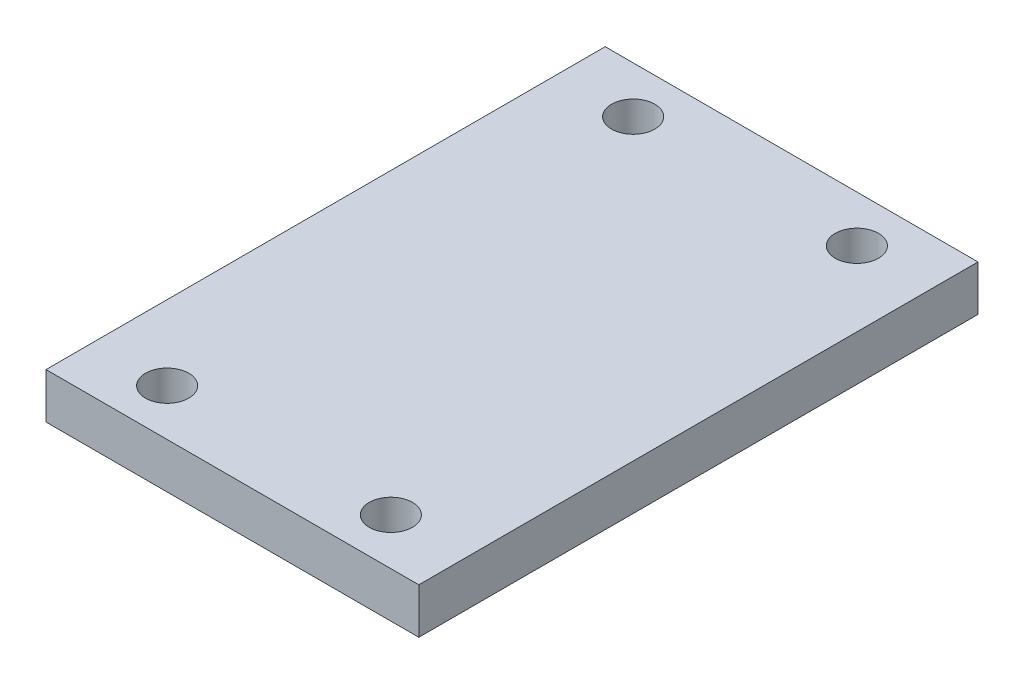
ISO-10303-21;
HEADER;
FILE_DESCRIPTION(('STEP AP214'),'2;1');
FILE_NAME('part.step','',(''),(''),'','','');
FILE_SCHEMA(('AUTOMOTIVE_DESIGN { 1 0 10303 214 1 1 1 1 }'));
ENDSEC;
DATA;
#1=APPLICATION_CONTEXT('core data for automotive mechanical design processes');
#2=APPLICATION_PROTOCOL_DEFINITION('international standard','automotive_design',2000,#1);
#3=PRODUCT_CONTEXT('',#1,'mechanical');
#4=PRODUCT('Part','Part','',(#3));
#5=PRODUCT_RELATED_PRODUCT_CATEGORY('part','',(#4));
#6=PRODUCT_DEFINITION_FORMATION('','',#4);
#7=PRODUCT_DEFINITION_CONTEXT('part definition',#1,'design');
#8=PRODUCT_DEFINITION('design','',#6,#7);
#9=PRODUCT_DEFINITION_SHAPE('','',#8);
#10=(LENGTH_UNIT() NAMED_UNIT(*) SI_UNIT(.MILLI.,.METRE.));
#11=(NAMED_UNIT(*) PLANE_ANGLE_UNIT() SI_UNIT($,.RADIAN.));
#12=(NAMED_UNIT(*) SI_UNIT($,.STERADIAN.) SOLID_ANGLE_UNIT());
#13=UNCERTAINTY_MEASURE_WITH_UNIT(LENGTH_MEASURE(1.E-05),#10,'distance_accuracy_value','');
#14=(GEOMETRIC_REPRESENTATION_CONTEXT(3) GLOBAL_UNCERTAINTY_ASSIGNED_CONTEXT((#13)) GLOBAL_UNIT_ASSIGNED_CONTEXT((#10,
#11,#12)) REPRESENTATION_CONTEXT('',''));
#15=CARTESIAN_POINT('',(0.,0.,0.));
#16=DIRECTION('',(0.,0.,1.));
#17=DIRECTION('',(1.,0.,0.));
#18=AXIS2_PLACEMENT_3D('',#15,#16,#17);
#19=CARTESIAN_POINT('',(-25.4,3.0988,19.05));
#20=DIRECTION('',(0.,1.,0.));
#21=DIRECTION('',(0.,0.,1.));
#22=AXIS2_PLACEMENT_3D('',#19,#20,#21);
#23=PLANE('',#22);
#24=CARTESIAN_POINT('',(-20.32,3.0988,-15.875));
#25=DIRECTION('',(0.,1.,0.));
#26=DIRECTION('',(0.,0.,-1.));
#27=AXIS2_PLACEMENT_3D('',#24,#25,#26);
#28=CIRCLE('',#27,1.4732);
#29=CARTESIAN_POINT('',(-20.32,3.0988,-17.3482));
#30=VERTEX_POINT('',#29);
#31=EDGE_CURVE('E152',#30,#30,#28,.T.);
#32=ORIENTED_EDGE('',*,*,#31,.F.);
#33=EDGE_LOOP('',(#32));
#34=FACE_BOUND('',#33,.T.);
#35=CARTESIAN_POINT('',(-5.08000000000001,3.0988,-15.875));
#36=DIRECTION('',(0.,1.,0.));
#37=DIRECTION('',(0.,0.,1.));
#38=AXIS2_PLACEMENT_3D('',#35,#36,#37);
#39=CIRCLE('',#38,1.4732);
#40=CARTESIAN_POINT('',(-5.08000000000001,3.0988,-14.4018));
#41=VERTEX_POINT('',#40);
#42=EDGE_CURVE('E122',#41,#41,#39,.T.);
#43=ORIENTED_EDGE('',*,*,#42,.F.);
#44=EDGE_LOOP('',(#43));
#45=FACE_BOUND('',#44,.T.);
#46=DIRECTION('',(0.,0.,1.));
#47=VECTOR('',#46,1.);
#48=CARTESIAN_POINT('',(-25.4,3.0988,-19.05));
#49=LINE('',#48,#47);
#50=CARTESIAN_POINT('',(-25.4,3.0988,-19.05));
#51=VERTEX_POINT('',#50);
#52=CARTESIAN_POINT('',(-25.4,3.0988,19.05));
#53=VERTEX_POINT('',#52);
#54=EDGE_CURVE('E100',#51,#53,#49,.T.);
#55=ORIENTED_EDGE('',*,*,#54,.T.);
#56=DIRECTION('',(1.,0.,0.));
#57=VECTOR('',#56,1.);
#58=CARTESIAN_POINT('',(-25.4,3.0988,19.05));
#59=LINE('',#58,#57);
#60=CARTESIAN_POINT('',(0.,3.0988,19.05));
#61=VERTEX_POINT('',#60);
#62=EDGE_CURVE('E94',#53,#61,#59,.T.);
#63=ORIENTED_EDGE('',*,*,#62,.T.);
#64=DIRECTION('',(0.,0.,-1.));
#65=VECTOR('',#64,1.);
#66=CARTESIAN_POINT('',(0.,3.0988,-19.05));
#67=LINE('',#66,#65);
#68=CARTESIAN_POINT('',(0.,3.0988,-19.05));
#69=VERTEX_POINT('',#68);
#70=EDGE_CURVE('E98',#61,#69,#67,.T.);
#71=ORIENTED_EDGE('',*,*,#70,.T.);
#72=DIRECTION('',(-1.,0.,0.));
#73=VECTOR('',#72,1.);
#74=CARTESIAN_POINT('',(-25.4,3.0988,-19.05));
#75=LINE('',#74,#73);
#76=EDGE_CURVE('E60',#69,#51,#75,.T.);
#77=ORIENTED_EDGE('',*,*,#76,.T.);
#78=EDGE_LOOP('',(#55,#63,#71,#77));
#79=FACE_BOUND('',#78,.T.);
#80=CARTESIAN_POINT('',(-20.32,3.0988,15.875));
#81=DIRECTION('',(0.,1.,0.));
#82=DIRECTION('',(0.,0.,1.));
#83=AXIS2_PLACEMENT_3D('',#80,#81,#82);
#84=CIRCLE('',#83,1.4732);
#85=CARTESIAN_POINT('',(-20.32,3.0988,17.3482));
#86=VERTEX_POINT('',#85);
#87=EDGE_CURVE('E144',#86,#86,#84,.T.);
#88=ORIENTED_EDGE('',*,*,#87,.F.);
#89=EDGE_LOOP('',(#88));
#90=FACE_BOUND('',#89,.T.);
#91=CARTESIAN_POINT('',(-5.08000000000001,3.0988,15.875));
#92=DIRECTION('',(0.,1.,0.));
#93=DIRECTION('',(0.,0.,-1.));
#94=AXIS2_PLACEMENT_3D('',#91,#92,#93);
#95=CIRCLE('',#94,1.4732);
#96=CARTESIAN_POINT('',(-5.08000000000001,3.0988,14.4018));
#97=VERTEX_POINT('',#96);
#98=EDGE_CURVE('E159',#97,#97,#95,.T.);
#99=ORIENTED_EDGE('',*,*,#98,.F.);
#100=EDGE_LOOP('',(#99));
#101=FACE_BOUND('',#100,.T.);
#102=ADVANCED_FACE('F39',(#34,#45,#79,#90,#101),#23,.T.);
#103=CARTESIAN_POINT('',(-25.4,0.,19.05));
#104=DIRECTION('',(0.,1.,0.));
#105=DIRECTION('',(0.,0.,1.));
#106=AXIS2_PLACEMENT_3D('',#103,#104,#105);
#107=PLANE('',#106);
#108=CARTESIAN_POINT('',(-20.32,0.,-15.875));
#109=DIRECTION('',(0.,1.,0.));
#110=DIRECTION('',(0.,0.,-1.));
#111=AXIS2_PLACEMENT_3D('',#108,#109,#110);
#112=CIRCLE('',#111,1.4732);
#113=CARTESIAN_POINT('',(-20.32,0.,-17.3482));
#114=VERTEX_POINT('',#113);
#115=EDGE_CURVE('E155',#114,#114,#112,.T.);
#116=ORIENTED_EDGE('',*,*,#115,.T.);
#117=EDGE_LOOP('',(#116));
#118=FACE_BOUND('',#117,.T.);
#119=CARTESIAN_POINT('',(-5.08000000000001,0.,-15.875));
#120=DIRECTION('',(0.,1.,0.));
#121=DIRECTION('',(0.,0.,1.));
#122=AXIS2_PLACEMENT_3D('',#119,#120,#121);
#123=CIRCLE('',#122,1.4732);
#124=CARTESIAN_POINT('',(-5.08000000000001,0.,-14.4018));
#125=VERTEX_POINT('',#124);
#126=EDGE_CURVE('E140',#125,#125,#123,.T.);
#127=ORIENTED_EDGE('',*,*,#126,.T.);
#128=EDGE_LOOP('',(#127));
#129=FACE_BOUND('',#128,.T.);
#130=DIRECTION('',(0.,0.,1.));
#131=VECTOR('',#130,1.);
#132=CARTESIAN_POINT('',(-25.4,0.,-19.05));
#133=LINE('',#132,#131);
#134=CARTESIAN_POINT('',(-25.4,0.,-19.05));
#135=VERTEX_POINT('',#134);
#136=CARTESIAN_POINT('',(-25.4,0.,19.05));
#137=VERTEX_POINT('',#136);
#138=EDGE_CURVE('E118',#135,#137,#133,.T.);
#139=ORIENTED_EDGE('',*,*,#138,.F.);
#140=DIRECTION('',(-1.,0.,0.));
#141=VECTOR('',#140,1.);
#142=CARTESIAN_POINT('',(-25.4,0.,-19.05));
#143=LINE('',#142,#141);
#144=CARTESIAN_POINT('',(0.,0.,-19.05));
#145=VERTEX_POINT('',#144);
#146=EDGE_CURVE('E86',#145,#135,#143,.T.);
#147=ORIENTED_EDGE('',*,*,#146,.F.);
#148=DIRECTION('',(0.,0.,-1.));
#149=VECTOR('',#148,1.);
#150=CARTESIAN_POINT('',(0.,0.,-19.05));
#151=LINE('',#150,#149);
#152=CARTESIAN_POINT('',(0.,0.,19.05));
#153=VERTEX_POINT('',#152);
#154=EDGE_CURVE('E80',#153,#145,#151,.T.);
#155=ORIENTED_EDGE('',*,*,#154,.F.);
#156=DIRECTION('',(1.,0.,0.));
#157=VECTOR('',#156,1.);
#158=CARTESIAN_POINT('',(-25.4,0.,19.05));
#159=LINE('',#158,#157);
#160=EDGE_CURVE('E105',#137,#153,#159,.T.);
#161=ORIENTED_EDGE('',*,*,#160,.F.);
#162=EDGE_LOOP('',(#139,#147,#155,#161));
#163=FACE_BOUND('',#162,.T.);
#164=CARTESIAN_POINT('',(-20.32,0.,15.875));
#165=DIRECTION('',(0.,1.,0.));
#166=DIRECTION('',(0.,0.,1.));
#167=AXIS2_PLACEMENT_3D('',#164,#165,#166);
#168=CIRCLE('',#167,1.4732);
#169=CARTESIAN_POINT('',(-20.32,0.,17.3482));
#170=VERTEX_POINT('',#169);
#171=EDGE_CURVE('E148',#170,#170,#168,.T.);
#172=ORIENTED_EDGE('',*,*,#171,.T.);
#173=EDGE_LOOP('',(#172));
#174=FACE_BOUND('',#173,.T.);
#175=CARTESIAN_POINT('',(-5.08000000000001,0.,15.875));
#176=DIRECTION('',(0.,1.,0.));
#177=DIRECTION('',(0.,0.,-1.));
#178=AXIS2_PLACEMENT_3D('',#175,#176,#177);
#179=CIRCLE('',#178,1.4732);
#180=CARTESIAN_POINT('',(-5.08000000000001,0.,14.4018));
#181=VERTEX_POINT('',#180);
#182=EDGE_CURVE('E163',#181,#181,#179,.T.);
#183=ORIENTED_EDGE('',*,*,#182,.T.);
#184=EDGE_LOOP('',(#183));
#185=FACE_BOUND('',#184,.T.);
#186=ADVANCED_FACE('F134',(#118,#129,#163,#174,#185),#107,.F.);
#187=CARTESIAN_POINT('',(-25.4,3.0988,-19.05));
#188=DIRECTION('',(1.,0.,0.));
#189=DIRECTION('',(0.,0.,-1.));
#190=AXIS2_PLACEMENT_3D('',#187,#188,#189);
#191=PLANE('',#190);
#192=ORIENTED_EDGE('',*,*,#138,.T.);
#193=DIRECTION('',(0.,-1.,0.));
#194=VECTOR('',#193,1.);
#195=CARTESIAN_POINT('',(-25.4,3.0988,19.05));
#196=LINE('',#195,#194);
#197=EDGE_CURVE('E11',#53,#137,#196,.T.);
#198=ORIENTED_EDGE('',*,*,#197,.F.);
#199=ORIENTED_EDGE('',*,*,#54,.F.);
#200=DIRECTION('',(0.,-1.,0.));
#201=VECTOR('',#200,1.);
#202=CARTESIAN_POINT('',(-25.4,3.0988,-19.05));
#203=LINE('',#202,#201);
#204=EDGE_CURVE('E114',#51,#135,#203,.T.);
#205=ORIENTED_EDGE('',*,*,#204,.T.);
#206=EDGE_LOOP('',(#192,#198,#199,#205));
#207=FACE_BOUND('',#206,.T.);
#208=ADVANCED_FACE('F41',(#207),#191,.F.);
#209=CARTESIAN_POINT('',(-25.4,3.0988,19.05));
#210=DIRECTION('',(0.,0.,-1.));
#211=DIRECTION('',(-1.,0.,0.));
#212=AXIS2_PLACEMENT_3D('',#209,#210,#211);
#213=PLANE('',#212);
#214=ORIENTED_EDGE('',*,*,#160,.T.);
#215=DIRECTION('',(0.,-1.,0.));
#216=VECTOR('',#215,1.);
#217=CARTESIAN_POINT('',(0.,3.0988,19.05));
#218=LINE('',#217,#216);
#219=EDGE_CURVE('E49',#61,#153,#218,.T.);
#220=ORIENTED_EDGE('',*,*,#219,.F.);
#221=ORIENTED_EDGE('',*,*,#62,.F.);
#222=ORIENTED_EDGE('',*,*,#197,.T.);
#223=EDGE_LOOP('',(#214,#220,#221,#222));
#224=FACE_BOUND('',#223,.T.);
#225=ADVANCED_FACE('F104',(#224),#213,.F.);
#226=CARTESIAN_POINT('',(0.,3.0988,-19.05));
#227=DIRECTION('',(-1.,0.,0.));
#228=DIRECTION('',(0.,0.,1.));
#229=AXIS2_PLACEMENT_3D('',#226,#227,#228);
#230=PLANE('',#229);
#231=ORIENTED_EDGE('',*,*,#154,.T.);
#232=DIRECTION('',(0.,-1.,0.));
#233=VECTOR('',#232,1.);
#234=CARTESIAN_POINT('',(0.,3.0988,-19.05));
#235=LINE('',#234,#233);
#236=EDGE_CURVE('E107',#69,#145,#235,.T.);
#237=ORIENTED_EDGE('',*,*,#236,.F.);
#238=ORIENTED_EDGE('',*,*,#70,.F.);
#239=ORIENTED_EDGE('',*,*,#219,.T.);
#240=EDGE_LOOP('',(#231,#237,#238,#239));
#241=FACE_BOUND('',#240,.T.);
#242=ADVANCED_FACE('F108',(#241),#230,.F.);
#243=CARTESIAN_POINT('',(-25.4,3.0988,-19.05));
#244=DIRECTION('',(0.,0.,1.));
#245=DIRECTION('',(1.,0.,0.));
#246=AXIS2_PLACEMENT_3D('',#243,#244,#245);
#247=PLANE('',#246);
#248=ORIENTED_EDGE('',*,*,#146,.T.);
#249=ORIENTED_EDGE('',*,*,#204,.F.);
#250=ORIENTED_EDGE('',*,*,#76,.F.);
#251=ORIENTED_EDGE('',*,*,#236,.T.);
#252=EDGE_LOOP('',(#248,#249,#250,#251));
#253=FACE_BOUND('',#252,.T.);
#254=ADVANCED_FACE('F131',(#253),#247,.F.);
#255=CARTESIAN_POINT('',(-5.08000000000001,3.0988,-15.875));
#256=DIRECTION('',(0.,-1.,0.));
#257=DIRECTION('',(0.,0.,-1.));
#258=AXIS2_PLACEMENT_3D('',#255,#256,#257);
#259=CYLINDRICAL_SURFACE('',#258,1.4732);
#260=ORIENTED_EDGE('',*,*,#42,.T.);
#261=EDGE_LOOP('',(#260));
#262=FACE_BOUND('',#261,.T.);
#263=ORIENTED_EDGE('',*,*,#126,.F.);
#264=EDGE_LOOP('',(#263));
#265=FACE_BOUND('',#264,.T.);
#266=ADVANCED_FACE('F184',(#262,#265),#259,.F.);
#267=CARTESIAN_POINT('',(-20.32,3.0988,15.875));
#268=DIRECTION('',(0.,-1.,0.));
#269=DIRECTION('',(0.,0.,-1.));
#270=AXIS2_PLACEMENT_3D('',#267,#268,#269);
#271=CYLINDRICAL_SURFACE('',#270,1.4732);
#272=ORIENTED_EDGE('',*,*,#87,.T.);
#273=EDGE_LOOP('',(#272));
#274=FACE_BOUND('',#273,.T.);
#275=ORIENTED_EDGE('',*,*,#171,.F.);
#276=EDGE_LOOP('',(#275));
#277=FACE_BOUND('',#276,.T.);
#278=ADVANCED_FACE('F230',(#274,#277),#271,.F.);
#279=CARTESIAN_POINT('',(-20.32,3.0988,-15.875));
#280=DIRECTION('',(0.,-1.,0.));
#281=DIRECTION('',(0.,0.,-1.));
#282=AXIS2_PLACEMENT_3D('',#279,#280,#281);
#283=CYLINDRICAL_SURFACE('',#282,1.4732);
#284=ORIENTED_EDGE('',*,*,#31,.T.);
#285=EDGE_LOOP('',(#284));
#286=FACE_BOUND('',#285,.T.);
#287=ORIENTED_EDGE('',*,*,#115,.F.);
#288=EDGE_LOOP('',(#287));
#289=FACE_BOUND('',#288,.T.);
#290=ADVANCED_FACE('F220',(#286,#289),#283,.F.);
#291=CARTESIAN_POINT('',(-5.08000000000001,3.0988,15.875));
#292=DIRECTION('',(0.,-1.,0.));
#293=DIRECTION('',(0.,0.,-1.));
#294=AXIS2_PLACEMENT_3D('',#291,#292,#293);
#295=CYLINDRICAL_SURFACE('',#294,1.4732);
#296=ORIENTED_EDGE('',*,*,#98,.T.);
#297=EDGE_LOOP('',(#296));
#298=FACE_BOUND('',#297,.T.);
#299=ORIENTED_EDGE('',*,*,#182,.F.);
#300=EDGE_LOOP('',(#299));
#301=FACE_BOUND('',#300,.T.);
#302=ADVANCED_FACE('F170',(#298,#301),#295,.F.);
#303=CLOSED_SHELL('',(#102,#186,#208,#225,#242,#254,#266,#278,#290,#302));
#304=MANIFOLD_SOLID_BREP('B2',#303);
#305=ADVANCED_BREP_SHAPE_REPRESENTATION('',(#18,#304),#14);
#306=SHAPE_DEFINITION_REPRESENTATION(#9,#305);
ENDSEC;
END-ISO-10303-21;
